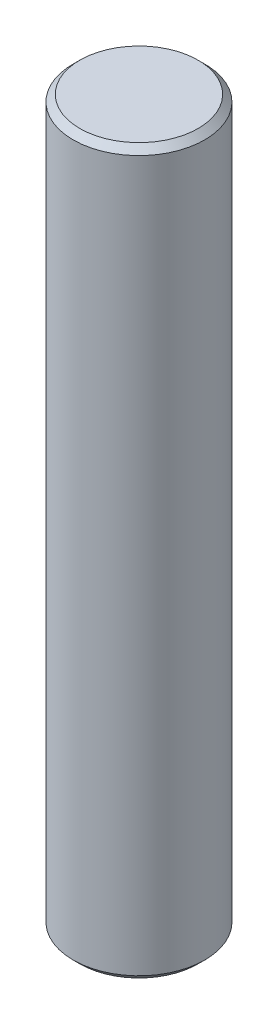
ISO-10303-21;
HEADER;
FILE_DESCRIPTION(('STEP AP214'),'2;1');
FILE_NAME('part.step','',(''),(''),'','','');
FILE_SCHEMA(('AUTOMOTIVE_DESIGN { 1 0 10303 214 1 1 1 1 }'));
ENDSEC;
DATA;
#1=APPLICATION_CONTEXT('core data for automotive mechanical design processes');
#2=APPLICATION_PROTOCOL_DEFINITION('international standard','automotive_design',2000,#1);
#3=PRODUCT_CONTEXT('',#1,'mechanical');
#4=PRODUCT('Part','Part','',(#3));
#5=PRODUCT_RELATED_PRODUCT_CATEGORY('part','',(#4));
#6=PRODUCT_DEFINITION_FORMATION('','',#4);
#7=PRODUCT_DEFINITION_CONTEXT('part definition',#1,'design');
#8=PRODUCT_DEFINITION('design','',#6,#7);
#9=PRODUCT_DEFINITION_SHAPE('','',#8);
#10=(LENGTH_UNIT() NAMED_UNIT(*) SI_UNIT(.MILLI.,.METRE.));
#11=(NAMED_UNIT(*) PLANE_ANGLE_UNIT() SI_UNIT($,.RADIAN.));
#12=(NAMED_UNIT(*) SI_UNIT($,.STERADIAN.) SOLID_ANGLE_UNIT());
#13=UNCERTAINTY_MEASURE_WITH_UNIT(LENGTH_MEASURE(1.E-05),#10,'distance_accuracy_value','');
#14=(GEOMETRIC_REPRESENTATION_CONTEXT(3) GLOBAL_UNCERTAINTY_ASSIGNED_CONTEXT((#13)) GLOBAL_UNIT_ASSIGNED_CONTEXT((#10,
#11,#12)) REPRESENTATION_CONTEXT('',''));
#15=CARTESIAN_POINT('',(0.,0.,0.));
#16=DIRECTION('',(0.,0.,1.));
#17=DIRECTION('',(1.,0.,0.));
#18=AXIS2_PLACEMENT_3D('',#15,#16,#17);
#19=CARTESIAN_POINT('',(0.,27.5,0.));
#20=DIRECTION('',(0.,-1.,0.));
#21=DIRECTION('',(0.,0.,-1.));
#22=AXIS2_PLACEMENT_3D('',#19,#20,#21);
#23=CYLINDRICAL_SURFACE('',#22,5.);
#24=CARTESIAN_POINT('',(0.,-27.,0.));
#25=DIRECTION('',(0.,1.,0.));
#26=DIRECTION('',(0.,0.,1.));
#27=AXIS2_PLACEMENT_3D('',#24,#25,#26);
#28=CIRCLE('',#27,5.);
#29=CARTESIAN_POINT('',(0.,-27.,5.));
#30=VERTEX_POINT('',#29);
#31=EDGE_CURVE('E56',#30,#30,#28,.T.);
#32=ORIENTED_EDGE('',*,*,#31,.T.);
#33=EDGE_LOOP('',(#32));
#34=FACE_BOUND('',#33,.T.);
#35=CARTESIAN_POINT('',(0.,27.,0.));
#36=DIRECTION('',(0.,1.,0.));
#37=DIRECTION('',(0.,0.,1.));
#38=AXIS2_PLACEMENT_3D('',#35,#36,#37);
#39=CIRCLE('',#38,5.);
#40=CARTESIAN_POINT('',(0.,27.,5.));
#41=VERTEX_POINT('',#40);
#42=EDGE_CURVE('E61',#41,#41,#39,.F.);
#43=ORIENTED_EDGE('',*,*,#42,.T.);
#44=EDGE_LOOP('',(#43));
#45=FACE_BOUND('',#44,.T.);
#46=ADVANCED_FACE('F44',(#34,#45),#23,.T.);
#47=CARTESIAN_POINT('',(0.,27.5,0.));
#48=DIRECTION('',(0.,1.,0.));
#49=DIRECTION('',(0.,0.,1.));
#50=AXIS2_PLACEMENT_3D('',#47,#48,#49);
#51=PLANE('',#50);
#52=CARTESIAN_POINT('',(0.,27.5,0.));
#53=DIRECTION('',(0.,1.,0.));
#54=DIRECTION('',(0.,0.,1.));
#55=AXIS2_PLACEMENT_3D('',#52,#53,#54);
#56=CIRCLE('',#55,4.50000000000001);
#57=CARTESIAN_POINT('',(0.,27.5,4.50000000000001));
#58=VERTEX_POINT('',#57);
#59=EDGE_CURVE('E10',#58,#58,#56,.T.);
#60=ORIENTED_EDGE('',*,*,#59,.T.);
#61=EDGE_LOOP('',(#60));
#62=FACE_BOUND('',#61,.T.);
#63=ADVANCED_FACE('F84',(#62),#51,.T.);
#64=CARTESIAN_POINT('',(0.,-27.5,0.));
#65=DIRECTION('',(0.,1.,0.));
#66=DIRECTION('',(0.,0.,1.));
#67=AXIS2_PLACEMENT_3D('',#64,#65,#66);
#68=PLANE('',#67);
#69=CARTESIAN_POINT('',(0.,-27.5,0.));
#70=DIRECTION('',(0.,1.,0.));
#71=DIRECTION('',(0.,0.,1.));
#72=AXIS2_PLACEMENT_3D('',#69,#70,#71);
#73=CIRCLE('',#72,4.5);
#74=CARTESIAN_POINT('',(0.,-27.5,4.5));
#75=VERTEX_POINT('',#74);
#76=EDGE_CURVE('E53',#75,#75,#73,.F.);
#77=ORIENTED_EDGE('',*,*,#76,.T.);
#78=EDGE_LOOP('',(#77));
#79=FACE_BOUND('',#78,.T.);
#80=ADVANCED_FACE('F79',(#79),#68,.F.);
#81=CARTESIAN_POINT('',(0.,-27.,0.));
#82=DIRECTION('',(0.,1.,0.));
#83=DIRECTION('',(0.,0.,1.));
#84=AXIS2_PLACEMENT_3D('',#81,#82,#83);
#85=CONICAL_SURFACE('',#84,5.,0.785398163397451);
#86=ORIENTED_EDGE('',*,*,#76,.F.);
#87=EDGE_LOOP('',(#86));
#88=FACE_BOUND('',#87,.T.);
#89=ORIENTED_EDGE('',*,*,#31,.F.);
#90=EDGE_LOOP('',(#89));
#91=FACE_BOUND('',#90,.T.);
#92=ADVANCED_FACE('F74',(#88,#91),#85,.T.);
#93=CARTESIAN_POINT('',(0.,27.5,0.));
#94=DIRECTION('',(0.,-1.,0.));
#95=DIRECTION('',(0.,0.,-1.));
#96=AXIS2_PLACEMENT_3D('',#93,#94,#95);
#97=CONICAL_SURFACE('',#96,4.50000000000001,0.785398163397447);
#98=ORIENTED_EDGE('',*,*,#42,.F.);
#99=EDGE_LOOP('',(#98));
#100=FACE_BOUND('',#99,.T.);
#101=ORIENTED_EDGE('',*,*,#59,.F.);
#102=EDGE_LOOP('',(#101));
#103=FACE_BOUND('',#102,.T.);
#104=ADVANCED_FACE('F48',(#100,#103),#97,.T.);
#105=CLOSED_SHELL('',(#46,#63,#80,#92,#104));
#106=MANIFOLD_SOLID_BREP('B2',#105);
#107=ADVANCED_BREP_SHAPE_REPRESENTATION('',(#18,#106),#14);
#108=SHAPE_DEFINITION_REPRESENTATION(#9,#107);
ENDSEC;
END-ISO-10303-21;
